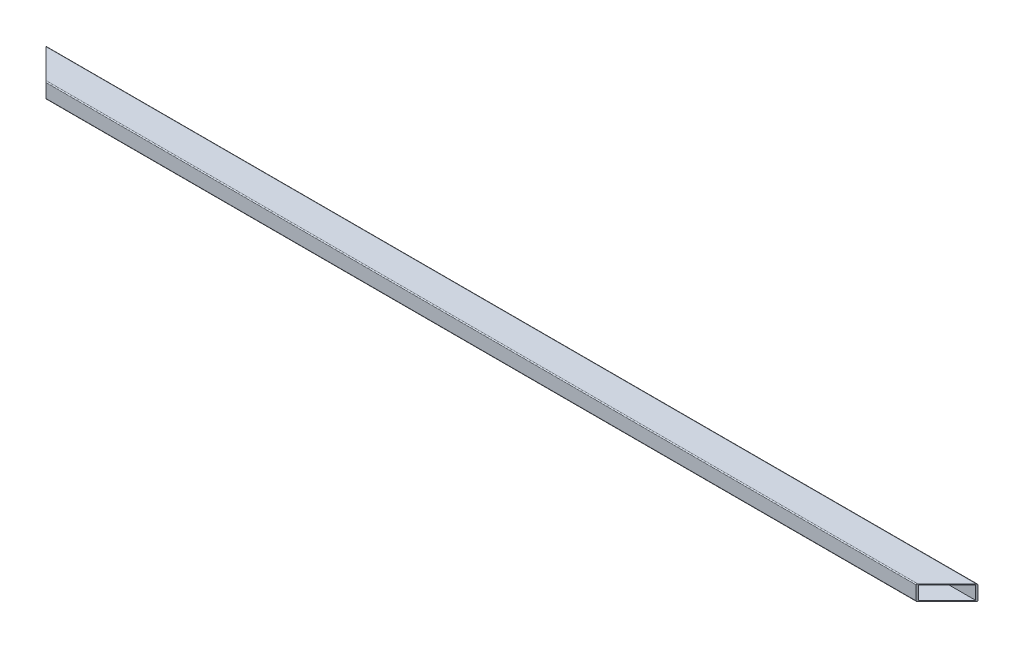
ISO-10303-21;
HEADER;
FILE_DESCRIPTION(('STEP AP214'),'2;1');
FILE_NAME('part.step','',(''),(''),'','','');
FILE_SCHEMA(('AUTOMOTIVE_DESIGN { 1 0 10303 214 1 1 1 1 }'));
ENDSEC;
DATA;
#1=APPLICATION_CONTEXT('core data for automotive mechanical design processes');
#2=APPLICATION_PROTOCOL_DEFINITION('international standard','automotive_design',2000,#1);
#3=PRODUCT_CONTEXT('',#1,'mechanical');
#4=PRODUCT('Part','Part','',(#3));
#5=PRODUCT_RELATED_PRODUCT_CATEGORY('part','',(#4));
#6=PRODUCT_DEFINITION_FORMATION('','',#4);
#7=PRODUCT_DEFINITION_CONTEXT('part definition',#1,'design');
#8=PRODUCT_DEFINITION('design','',#6,#7);
#9=PRODUCT_DEFINITION_SHAPE('','',#8);
#10=(LENGTH_UNIT() NAMED_UNIT(*) SI_UNIT(.MILLI.,.METRE.));
#11=(NAMED_UNIT(*) PLANE_ANGLE_UNIT() SI_UNIT($,.RADIAN.));
#12=(NAMED_UNIT(*) SI_UNIT($,.STERADIAN.) SOLID_ANGLE_UNIT());
#13=UNCERTAINTY_MEASURE_WITH_UNIT(LENGTH_MEASURE(1.E-05),#10,'distance_accuracy_value','');
#14=(GEOMETRIC_REPRESENTATION_CONTEXT(3) GLOBAL_UNCERTAINTY_ASSIGNED_CONTEXT((#13)) GLOBAL_UNIT_ASSIGNED_CONTEXT((#10,
#11,#12)) REPRESENTATION_CONTEXT('',''));
#15=CARTESIAN_POINT('',(0.,0.,0.));
#16=DIRECTION('',(0.,0.,1.));
#17=DIRECTION('',(1.,0.,0.));
#18=AXIS2_PLACEMENT_3D('',#15,#16,#17);
#19=CARTESIAN_POINT('',(762.,-11.,23.5));
#20=DIRECTION('',(-1.,0.,0.));
#21=DIRECTION('',(0.,0.,1.));
#22=AXIS2_PLACEMENT_3D('',#19,#20,#21);
#23=CYLINDRICAL_SURFACE('',#22,1.5);
#24=DIRECTION('',(-1.,0.,0.));
#25=VECTOR('',#24,1.);
#26=CARTESIAN_POINT('',(762.,-12.5,23.5));
#27=LINE('',#26,#25);
#28=CARTESIAN_POINT('',(701.5,-12.5,23.5));
#29=VERTEX_POINT('',#28);
#30=CARTESIAN_POINT('',(-701.5,-12.5,23.5));
#31=VERTEX_POINT('',#30);
#32=EDGE_CURVE('E215',#29,#31,#27,.T.);
#33=ORIENTED_EDGE('',*,*,#32,.F.);
#34=CARTESIAN_POINT('',(701.5,-11.,23.5));
#35=DIRECTION('',(-0.707106781186544,0.,-0.707106781186551));
#36=DIRECTION('',(-0.707106781186551,0.,0.707106781186544));
#37=AXIS2_PLACEMENT_3D('',#34,#35,#36);
#38=ELLIPSE('',#37,2.12132034355965,1.5);
#39=CARTESIAN_POINT('',(700.,-11.,25.));
#40=VERTEX_POINT('',#39);
#41=EDGE_CURVE('E162',#29,#40,#38,.T.);
#42=ORIENTED_EDGE('',*,*,#41,.T.);
#43=DIRECTION('',(-1.,0.,0.));
#44=VECTOR('',#43,1.);
#45=CARTESIAN_POINT('',(762.,-11.,25.));
#46=LINE('',#45,#44);
#47=CARTESIAN_POINT('',(-700.,-11.,25.));
#48=VERTEX_POINT('',#47);
#49=EDGE_CURVE('E200',#40,#48,#46,.T.);
#50=ORIENTED_EDGE('',*,*,#49,.T.);
#51=CARTESIAN_POINT('',(-701.5,-11.,23.5));
#52=DIRECTION('',(-0.707106781186544,0.,0.707106781186551));
#53=DIRECTION('',(-0.707106781186551,0.,-0.707106781186544));
#54=AXIS2_PLACEMENT_3D('',#51,#52,#53);
#55=ELLIPSE('',#54,2.12132034355965,1.5);
#56=EDGE_CURVE('E130',#31,#48,#55,.T.);
#57=ORIENTED_EDGE('',*,*,#56,.F.);
#58=EDGE_LOOP('',(#33,#42,#50,#57));
#59=FACE_BOUND('',#58,.T.);
#60=ADVANCED_FACE('F34',(#59),#23,.T.);
#61=CARTESIAN_POINT('',(762.,-12.5,23.5));
#62=DIRECTION('',(0.,1.,0.));
#63=DIRECTION('',(0.,0.,1.));
#64=AXIS2_PLACEMENT_3D('',#61,#62,#63);
#65=PLANE('',#64);
#66=DIRECTION('',(-1.,0.,0.));
#67=VECTOR('',#66,1.);
#68=CARTESIAN_POINT('',(762.,-12.5,-23.5));
#69=LINE('',#68,#67);
#70=CARTESIAN_POINT('',(748.5,-12.5,-23.5));
#71=VERTEX_POINT('',#70);
#72=CARTESIAN_POINT('',(-748.5,-12.5,-23.5));
#73=VERTEX_POINT('',#72);
#74=EDGE_CURVE('E213',#71,#73,#69,.T.);
#75=ORIENTED_EDGE('',*,*,#74,.F.);
#76=DIRECTION('',(-0.707106781186551,0.,0.707106781186544));
#77=VECTOR('',#76,1.);
#78=CARTESIAN_POINT('',(731.75,-12.5,-6.75000000000017));
#79=LINE('',#78,#77);
#80=EDGE_CURVE('E159',#71,#29,#79,.T.);
#81=ORIENTED_EDGE('',*,*,#80,.T.);
#82=ORIENTED_EDGE('',*,*,#32,.T.);
#83=DIRECTION('',(0.707106781186551,0.,0.707106781186544));
#84=VECTOR('',#83,1.);
#85=CARTESIAN_POINT('',(30.2500000000071,-12.5,755.25));
#86=LINE('',#85,#84);
#87=EDGE_CURVE('E191',#73,#31,#86,.T.);
#88=ORIENTED_EDGE('',*,*,#87,.F.);
#89=EDGE_LOOP('',(#75,#81,#82,#88));
#90=FACE_BOUND('',#89,.T.);
#91=ADVANCED_FACE('F221',(#90),#65,.F.);
#92=CARTESIAN_POINT('',(762.,-11.,-23.5));
#93=DIRECTION('',(-1.,0.,0.));
#94=DIRECTION('',(0.,0.,1.));
#95=AXIS2_PLACEMENT_3D('',#92,#93,#94);
#96=CYLINDRICAL_SURFACE('',#95,1.5);
#97=DIRECTION('',(-1.,0.,0.));
#98=VECTOR('',#97,1.);
#99=CARTESIAN_POINT('',(762.,-11.,-25.));
#100=LINE('',#99,#98);
#101=CARTESIAN_POINT('',(750.,-11.,-25.));
#102=VERTEX_POINT('',#101);
#103=CARTESIAN_POINT('',(-750.,-11.,-25.));
#104=VERTEX_POINT('',#103);
#105=EDGE_CURVE('E211',#102,#104,#100,.T.);
#106=ORIENTED_EDGE('',*,*,#105,.F.);
#107=CARTESIAN_POINT('',(748.5,-11.,-23.5));
#108=DIRECTION('',(-0.707106781186544,0.,-0.707106781186551));
#109=DIRECTION('',(-0.707106781186551,0.,0.707106781186544));
#110=AXIS2_PLACEMENT_3D('',#107,#108,#109);
#111=ELLIPSE('',#110,2.12132034355965,1.5);
#112=EDGE_CURVE('E156',#102,#71,#111,.T.);
#113=ORIENTED_EDGE('',*,*,#112,.T.);
#114=ORIENTED_EDGE('',*,*,#74,.T.);
#115=CARTESIAN_POINT('',(-748.5,-11.,-23.5));
#116=DIRECTION('',(-0.707106781186544,0.,0.707106781186551));
#117=DIRECTION('',(-0.707106781186551,0.,-0.707106781186544));
#118=AXIS2_PLACEMENT_3D('',#115,#116,#117);
#119=ELLIPSE('',#118,2.12132034355965,1.5);
#120=EDGE_CURVE('E188',#104,#73,#119,.T.);
#121=ORIENTED_EDGE('',*,*,#120,.F.);
#122=EDGE_LOOP('',(#106,#113,#114,#121));
#123=FACE_BOUND('',#122,.T.);
#124=ADVANCED_FACE('F231',(#123),#96,.T.);
#125=CARTESIAN_POINT('',(762.,11.,-25.));
#126=DIRECTION('',(0.,0.,1.));
#127=DIRECTION('',(0.,-1.,0.));
#128=AXIS2_PLACEMENT_3D('',#125,#126,#127);
#129=PLANE('',#128);
#130=DIRECTION('',(-1.,0.,0.));
#131=VECTOR('',#130,1.);
#132=CARTESIAN_POINT('',(762.,11.,-25.));
#133=LINE('',#132,#131);
#134=CARTESIAN_POINT('',(750.,11.,-25.));
#135=VERTEX_POINT('',#134);
#136=CARTESIAN_POINT('',(-750.,11.,-25.));
#137=VERTEX_POINT('',#136);
#138=EDGE_CURVE('E209',#135,#137,#133,.T.);
#139=ORIENTED_EDGE('',*,*,#138,.F.);
#140=DIRECTION('',(0.,-1.,0.));
#141=VECTOR('',#140,1.);
#142=CARTESIAN_POINT('',(750.,11.,-25.));
#143=LINE('',#142,#141);
#144=EDGE_CURVE('E153',#135,#102,#143,.T.);
#145=ORIENTED_EDGE('',*,*,#144,.T.);
#146=ORIENTED_EDGE('',*,*,#105,.T.);
#147=DIRECTION('',(0.,-1.,0.));
#148=VECTOR('',#147,1.);
#149=CARTESIAN_POINT('',(-750.,11.0000000000005,-25.));
#150=LINE('',#149,#148);
#151=EDGE_CURVE('E185',#137,#104,#150,.T.);
#152=ORIENTED_EDGE('',*,*,#151,.F.);
#153=EDGE_LOOP('',(#139,#145,#146,#152));
#154=FACE_BOUND('',#153,.T.);
#155=ADVANCED_FACE('F234',(#154),#129,.F.);
#156=CARTESIAN_POINT('',(762.,11.,-23.5));
#157=DIRECTION('',(-1.,0.,0.));
#158=DIRECTION('',(0.,0.,1.));
#159=AXIS2_PLACEMENT_3D('',#156,#157,#158);
#160=CYLINDRICAL_SURFACE('',#159,1.5);
#161=DIRECTION('',(-1.,0.,0.));
#162=VECTOR('',#161,1.);
#163=CARTESIAN_POINT('',(762.,12.5,-23.5));
#164=LINE('',#163,#162);
#165=CARTESIAN_POINT('',(748.5,12.5,-23.5));
#166=VERTEX_POINT('',#165);
#167=CARTESIAN_POINT('',(-748.5,12.5,-23.4999999999999));
#168=VERTEX_POINT('',#167);
#169=EDGE_CURVE('E207',#166,#168,#164,.T.);
#170=ORIENTED_EDGE('',*,*,#169,.F.);
#171=CARTESIAN_POINT('',(748.5,11.,-23.5));
#172=DIRECTION('',(-0.707106781186544,0.,-0.707106781186551));
#173=DIRECTION('',(-0.707106781186551,0.,0.707106781186544));
#174=AXIS2_PLACEMENT_3D('',#171,#172,#173);
#175=ELLIPSE('',#174,2.12132034355965,1.5);
#176=EDGE_CURVE('E150',#166,#135,#175,.T.);
#177=ORIENTED_EDGE('',*,*,#176,.T.);
#178=ORIENTED_EDGE('',*,*,#138,.T.);
#179=CARTESIAN_POINT('',(-748.5,11.,-23.5));
#180=DIRECTION('',(-0.707106781186544,0.,0.707106781186551));
#181=DIRECTION('',(-0.707106781186551,0.,-0.707106781186544));
#182=AXIS2_PLACEMENT_3D('',#179,#180,#181);
#183=ELLIPSE('',#182,2.12132034355965,1.5);
#184=EDGE_CURVE('E182',#168,#137,#183,.T.);
#185=ORIENTED_EDGE('',*,*,#184,.F.);
#186=EDGE_LOOP('',(#170,#177,#178,#185));
#187=FACE_BOUND('',#186,.T.);
#188=ADVANCED_FACE('F238',(#187),#160,.T.);
#189=CARTESIAN_POINT('',(762.,12.5,23.5));
#190=DIRECTION('',(0.,-1.,0.));
#191=DIRECTION('',(0.,0.,-1.));
#192=AXIS2_PLACEMENT_3D('',#189,#190,#191);
#193=PLANE('',#192);
#194=DIRECTION('',(-1.,0.,0.));
#195=VECTOR('',#194,1.);
#196=CARTESIAN_POINT('',(762.,12.5,23.5));
#197=LINE('',#196,#195);
#198=CARTESIAN_POINT('',(701.5,12.5,23.5));
#199=VERTEX_POINT('',#198);
#200=CARTESIAN_POINT('',(-701.5,12.5,23.5));
#201=VERTEX_POINT('',#200);
#202=EDGE_CURVE('E205',#199,#201,#197,.T.);
#203=ORIENTED_EDGE('',*,*,#202,.F.);
#204=DIRECTION('',(0.707106781186551,0.,-0.707106781186544));
#205=VECTOR('',#204,1.);
#206=CARTESIAN_POINT('',(731.75,12.5,-6.75000000000017));
#207=LINE('',#206,#205);
#208=EDGE_CURVE('E147',#199,#166,#207,.T.);
#209=ORIENTED_EDGE('',*,*,#208,.T.);
#210=ORIENTED_EDGE('',*,*,#169,.T.);
#211=DIRECTION('',(-0.707106781186551,0.,-0.707106781186544));
#212=VECTOR('',#211,1.);
#213=CARTESIAN_POINT('',(30.2500000000071,12.5,755.25));
#214=LINE('',#213,#212);
#215=EDGE_CURVE('E179',#201,#168,#214,.T.);
#216=ORIENTED_EDGE('',*,*,#215,.F.);
#217=EDGE_LOOP('',(#203,#209,#210,#216));
#218=FACE_BOUND('',#217,.T.);
#219=ADVANCED_FACE('F241',(#218),#193,.F.);
#220=CARTESIAN_POINT('',(762.,11.,23.5));
#221=DIRECTION('',(-1.,0.,0.));
#222=DIRECTION('',(0.,0.,1.));
#223=AXIS2_PLACEMENT_3D('',#220,#221,#222);
#224=CYLINDRICAL_SURFACE('',#223,1.5);
#225=DIRECTION('',(-1.,0.,0.));
#226=VECTOR('',#225,1.);
#227=CARTESIAN_POINT('',(762.,11.,25.));
#228=LINE('',#227,#226);
#229=CARTESIAN_POINT('',(700.,11.,25.));
#230=VERTEX_POINT('',#229);
#231=CARTESIAN_POINT('',(-700.,11.,25.));
#232=VERTEX_POINT('',#231);
#233=EDGE_CURVE('E203',#230,#232,#228,.T.);
#234=ORIENTED_EDGE('',*,*,#233,.F.);
#235=CARTESIAN_POINT('',(701.5,11.,23.5));
#236=DIRECTION('',(-0.707106781186544,0.,-0.707106781186551));
#237=DIRECTION('',(-0.707106781186551,0.,0.707106781186544));
#238=AXIS2_PLACEMENT_3D('',#235,#236,#237);
#239=ELLIPSE('',#238,2.12132034355965,1.5);
#240=EDGE_CURVE('E48',#230,#199,#239,.T.);
#241=ORIENTED_EDGE('',*,*,#240,.T.);
#242=ORIENTED_EDGE('',*,*,#202,.T.);
#243=CARTESIAN_POINT('',(-701.5,11.,23.5));
#244=DIRECTION('',(-0.707106781186544,0.,0.707106781186551));
#245=DIRECTION('',(-0.707106781186551,0.,-0.707106781186544));
#246=AXIS2_PLACEMENT_3D('',#243,#244,#245);
#247=ELLIPSE('',#246,2.12132034355965,1.5);
#248=EDGE_CURVE('E176',#232,#201,#247,.T.);
#249=ORIENTED_EDGE('',*,*,#248,.F.);
#250=EDGE_LOOP('',(#234,#241,#242,#249));
#251=FACE_BOUND('',#250,.T.);
#252=ADVANCED_FACE('F246',(#251),#224,.T.);
#253=CARTESIAN_POINT('',(762.,11.,25.));
#254=DIRECTION('',(0.,0.,-1.));
#255=DIRECTION('',(0.,1.,0.));
#256=AXIS2_PLACEMENT_3D('',#253,#254,#255);
#257=PLANE('',#256);
#258=ORIENTED_EDGE('',*,*,#49,.F.);
#259=DIRECTION('',(0.,1.,0.));
#260=VECTOR('',#259,1.);
#261=CARTESIAN_POINT('',(700.,11.,25.));
#262=LINE('',#261,#260);
#263=EDGE_CURVE('E141',#40,#230,#262,.T.);
#264=ORIENTED_EDGE('',*,*,#263,.T.);
#265=ORIENTED_EDGE('',*,*,#233,.T.);
#266=DIRECTION('',(0.,1.,0.));
#267=VECTOR('',#266,1.);
#268=CARTESIAN_POINT('',(-700.,11.0000000000002,25.));
#269=LINE('',#268,#267);
#270=EDGE_CURVE('E173',#48,#232,#269,.T.);
#271=ORIENTED_EDGE('',*,*,#270,.F.);
#272=EDGE_LOOP('',(#258,#264,#265,#271));
#273=FACE_BOUND('',#272,.T.);
#274=ADVANCED_FACE('F248',(#273),#257,.F.);
#275=CARTESIAN_POINT('',(762.,-10.5,23.5));
#276=DIRECTION('',(0.,1.,0.));
#277=DIRECTION('',(0.,0.,1.));
#278=AXIS2_PLACEMENT_3D('',#275,#276,#277);
#279=PLANE('',#278);
#280=DIRECTION('',(-0.707106781186551,0.,0.707106781186544));
#281=VECTOR('',#280,1.);
#282=CARTESIAN_POINT('',(731.75,-10.5,-6.75000000000017));
#283=LINE('',#282,#281);
#284=CARTESIAN_POINT('',(748.,-10.5,-23.));
#285=VERTEX_POINT('',#284);
#286=CARTESIAN_POINT('',(702.,-10.5,23.));
#287=VERTEX_POINT('',#286);
#288=EDGE_CURVE('E56',#285,#287,#283,.T.);
#289=ORIENTED_EDGE('',*,*,#288,.F.);
#290=DIRECTION('',(-1.,0.,0.));
#291=VECTOR('',#290,1.);
#292=CARTESIAN_POINT('',(762.,-10.5,-23.));
#293=LINE('',#292,#291);
#294=CARTESIAN_POINT('',(-748.,-10.5,-23.));
#295=VERTEX_POINT('',#294);
#296=EDGE_CURVE('E196',#285,#295,#293,.T.);
#297=ORIENTED_EDGE('',*,*,#296,.T.);
#298=DIRECTION('',(0.707106781186551,0.,0.707106781186544));
#299=VECTOR('',#298,1.);
#300=CARTESIAN_POINT('',(30.2500000000071,-10.5,755.25));
#301=LINE('',#300,#299);
#302=CARTESIAN_POINT('',(-702.,-10.5,23.));
#303=VERTEX_POINT('',#302);
#304=EDGE_CURVE('E170',#295,#303,#301,.T.);
#305=ORIENTED_EDGE('',*,*,#304,.T.);
#306=DIRECTION('',(-1.,0.,0.));
#307=VECTOR('',#306,1.);
#308=CARTESIAN_POINT('',(762.,-10.5,23.));
#309=LINE('',#308,#307);
#310=EDGE_CURVE('E198',#287,#303,#309,.T.);
#311=ORIENTED_EDGE('',*,*,#310,.F.);
#312=EDGE_LOOP('',(#289,#297,#305,#311));
#313=FACE_BOUND('',#312,.T.);
#314=ADVANCED_FACE('F250',(#313),#279,.T.);
#315=CARTESIAN_POINT('',(762.,11.,-23.));
#316=DIRECTION('',(0.,0.,1.));
#317=DIRECTION('',(0.,-1.,0.));
#318=AXIS2_PLACEMENT_3D('',#315,#316,#317);
#319=PLANE('',#318);
#320=DIRECTION('',(0.,-1.,0.));
#321=VECTOR('',#320,1.);
#322=CARTESIAN_POINT('',(748.,11.,-23.));
#323=LINE('',#322,#321);
#324=CARTESIAN_POINT('',(748.,10.5,-23.));
#325=VERTEX_POINT('',#324);
#326=EDGE_CURVE('E138',#325,#285,#323,.T.);
#327=ORIENTED_EDGE('',*,*,#326,.F.);
#328=DIRECTION('',(-1.,0.,0.));
#329=VECTOR('',#328,1.);
#330=CARTESIAN_POINT('',(762.,10.5,-23.));
#331=LINE('',#330,#329);
#332=CARTESIAN_POINT('',(-748.,10.5,-23.));
#333=VERTEX_POINT('',#332);
#334=EDGE_CURVE('E129',#325,#333,#331,.T.);
#335=ORIENTED_EDGE('',*,*,#334,.T.);
#336=DIRECTION('',(0.,-1.,0.));
#337=VECTOR('',#336,1.);
#338=CARTESIAN_POINT('',(-748.,11.0000000000005,-23.));
#339=LINE('',#338,#337);
#340=EDGE_CURVE('E167',#333,#295,#339,.T.);
#341=ORIENTED_EDGE('',*,*,#340,.T.);
#342=ORIENTED_EDGE('',*,*,#296,.F.);
#343=EDGE_LOOP('',(#327,#335,#341,#342));
#344=FACE_BOUND('',#343,.T.);
#345=ADVANCED_FACE('F256',(#344),#319,.T.);
#346=CARTESIAN_POINT('',(762.,10.5,23.5));
#347=DIRECTION('',(0.,-1.,0.));
#348=DIRECTION('',(0.,0.,-1.));
#349=AXIS2_PLACEMENT_3D('',#346,#347,#348);
#350=PLANE('',#349);
#351=DIRECTION('',(0.707106781186551,0.,-0.707106781186544));
#352=VECTOR('',#351,1.);
#353=CARTESIAN_POINT('',(731.75,10.5,-6.75000000000017));
#354=LINE('',#353,#352);
#355=CARTESIAN_POINT('',(702.,10.5,23.));
#356=VERTEX_POINT('',#355);
#357=EDGE_CURVE('E134',#356,#325,#354,.T.);
#358=ORIENTED_EDGE('',*,*,#357,.F.);
#359=DIRECTION('',(-1.,0.,0.));
#360=VECTOR('',#359,1.);
#361=CARTESIAN_POINT('',(762.,10.5,23.));
#362=LINE('',#361,#360);
#363=CARTESIAN_POINT('',(-702.,10.5,23.));
#364=VERTEX_POINT('',#363);
#365=EDGE_CURVE('E122',#356,#364,#362,.T.);
#366=ORIENTED_EDGE('',*,*,#365,.T.);
#367=DIRECTION('',(-0.707106781186551,0.,-0.707106781186544));
#368=VECTOR('',#367,1.);
#369=CARTESIAN_POINT('',(30.2500000000071,10.5,755.25));
#370=LINE('',#369,#368);
#371=EDGE_CURVE('E165',#364,#333,#370,.T.);
#372=ORIENTED_EDGE('',*,*,#371,.T.);
#373=ORIENTED_EDGE('',*,*,#334,.F.);
#374=EDGE_LOOP('',(#358,#366,#372,#373));
#375=FACE_BOUND('',#374,.T.);
#376=ADVANCED_FACE('F135',(#375),#350,.T.);
#377=CARTESIAN_POINT('',(762.,11.,23.));
#378=DIRECTION('',(0.,0.,-1.));
#379=DIRECTION('',(0.,1.,0.));
#380=AXIS2_PLACEMENT_3D('',#377,#378,#379);
#381=PLANE('',#380);
#382=DIRECTION('',(0.,1.,0.));
#383=VECTOR('',#382,1.);
#384=CARTESIAN_POINT('',(702.,11.,23.));
#385=LINE('',#384,#383);
#386=EDGE_CURVE('E12',#287,#356,#385,.T.);
#387=ORIENTED_EDGE('',*,*,#386,.F.);
#388=ORIENTED_EDGE('',*,*,#310,.T.);
#389=DIRECTION('',(0.,1.,0.));
#390=VECTOR('',#389,1.);
#391=CARTESIAN_POINT('',(-702.,11.0000000000002,23.));
#392=LINE('',#391,#390);
#393=EDGE_CURVE('E41',#303,#364,#392,.T.);
#394=ORIENTED_EDGE('',*,*,#393,.T.);
#395=ORIENTED_EDGE('',*,*,#365,.F.);
#396=EDGE_LOOP('',(#387,#388,#394,#395));
#397=FACE_BOUND('',#396,.T.);
#398=ADVANCED_FACE('F124',(#397),#381,.T.);
#399=CARTESIAN_POINT('',(-362.499999999996,0.,362.5));
#400=DIRECTION('',(-0.707106781186544,0.,0.707106781186551));
#401=DIRECTION('',(0.707106781186551,0.,0.707106781186544));
#402=AXIS2_PLACEMENT_3D('',#399,#400,#401);
#403=PLANE('',#402);
#404=ORIENTED_EDGE('',*,*,#304,.F.);
#405=ORIENTED_EDGE('',*,*,#340,.F.);
#406=ORIENTED_EDGE('',*,*,#371,.F.);
#407=ORIENTED_EDGE('',*,*,#393,.F.);
#408=EDGE_LOOP('',(#404,#405,#406,#407));
#409=FACE_BOUND('',#408,.T.);
#410=ORIENTED_EDGE('',*,*,#87,.T.);
#411=ORIENTED_EDGE('',*,*,#56,.T.);
#412=ORIENTED_EDGE('',*,*,#270,.T.);
#413=ORIENTED_EDGE('',*,*,#248,.T.);
#414=ORIENTED_EDGE('',*,*,#215,.T.);
#415=ORIENTED_EDGE('',*,*,#184,.T.);
#416=ORIENTED_EDGE('',*,*,#151,.T.);
#417=ORIENTED_EDGE('',*,*,#120,.T.);
#418=EDGE_LOOP('',(#410,#411,#412,#413,#414,#415,#416,#417));
#419=FACE_BOUND('',#418,.T.);
#420=ADVANCED_FACE('F226',(#409,#419),#403,.T.);
#421=CARTESIAN_POINT('',(362.499999999996,0.,362.5));
#422=DIRECTION('',(-0.707106781186544,0.,-0.707106781186551));
#423=DIRECTION('',(-0.707106781186551,0.,0.707106781186544));
#424=AXIS2_PLACEMENT_3D('',#421,#422,#423);
#425=PLANE('',#424);
#426=ORIENTED_EDGE('',*,*,#326,.T.);
#427=ORIENTED_EDGE('',*,*,#288,.T.);
#428=ORIENTED_EDGE('',*,*,#386,.T.);
#429=ORIENTED_EDGE('',*,*,#357,.T.);
#430=EDGE_LOOP('',(#426,#427,#428,#429));
#431=FACE_BOUND('',#430,.T.);
#432=ORIENTED_EDGE('',*,*,#41,.F.);
#433=ORIENTED_EDGE('',*,*,#80,.F.);
#434=ORIENTED_EDGE('',*,*,#112,.F.);
#435=ORIENTED_EDGE('',*,*,#144,.F.);
#436=ORIENTED_EDGE('',*,*,#176,.F.);
#437=ORIENTED_EDGE('',*,*,#208,.F.);
#438=ORIENTED_EDGE('',*,*,#240,.F.);
#439=ORIENTED_EDGE('',*,*,#263,.F.);
#440=EDGE_LOOP('',(#432,#433,#434,#435,#436,#437,#438,#439));
#441=FACE_BOUND('',#440,.T.);
#442=ADVANCED_FACE('F140',(#431,#441),#425,.F.);
#443=CLOSED_SHELL('',(#60,#91,#124,#155,#188,#219,#252,#274,#314,#345,#376,#398,#420,#442));
#444=MANIFOLD_SOLID_BREP('B2',#443);
#445=ADVANCED_BREP_SHAPE_REPRESENTATION('',(#18,#444),#14);
#446=SHAPE_DEFINITION_REPRESENTATION(#9,#445);
ENDSEC;
END-ISO-10303-21;
